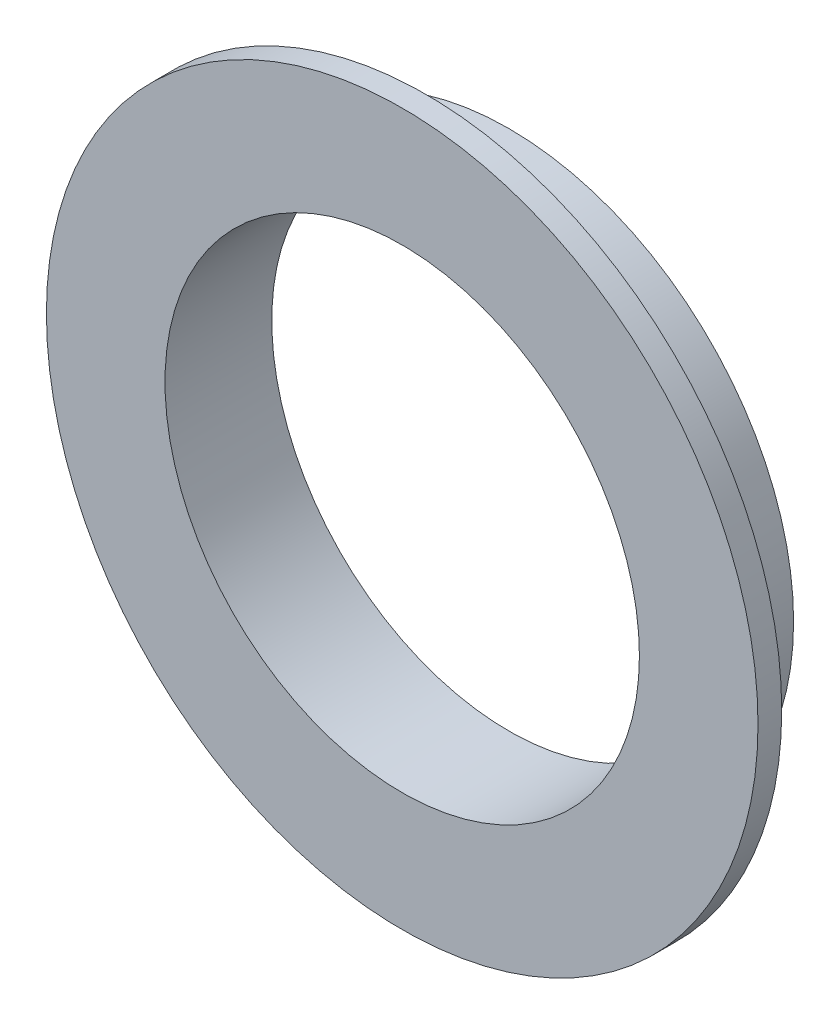
ISO-10303-21;
HEADER;
FILE_DESCRIPTION(('STEP AP214'),'2;1');
FILE_NAME('part.step','',(''),(''),'','','');
FILE_SCHEMA(('AUTOMOTIVE_DESIGN { 1 0 10303 214 1 1 1 1 }'));
ENDSEC;
DATA;
#1=APPLICATION_CONTEXT('core data for automotive mechanical design processes');
#2=APPLICATION_PROTOCOL_DEFINITION('international standard','automotive_design',2000,#1);
#3=PRODUCT_CONTEXT('',#1,'mechanical');
#4=PRODUCT('Part','Part','',(#3));
#5=PRODUCT_RELATED_PRODUCT_CATEGORY('part','',(#4));
#6=PRODUCT_DEFINITION_FORMATION('','',#4);
#7=PRODUCT_DEFINITION_CONTEXT('part definition',#1,'design');
#8=PRODUCT_DEFINITION('design','',#6,#7);
#9=PRODUCT_DEFINITION_SHAPE('','',#8);
#10=(LENGTH_UNIT() NAMED_UNIT(*) SI_UNIT(.MILLI.,.METRE.));
#11=(NAMED_UNIT(*) PLANE_ANGLE_UNIT() SI_UNIT($,.RADIAN.));
#12=(NAMED_UNIT(*) SI_UNIT($,.STERADIAN.) SOLID_ANGLE_UNIT());
#13=UNCERTAINTY_MEASURE_WITH_UNIT(LENGTH_MEASURE(1.E-05),#10,'distance_accuracy_value','');
#14=(GEOMETRIC_REPRESENTATION_CONTEXT(3) GLOBAL_UNCERTAINTY_ASSIGNED_CONTEXT((#13)) GLOBAL_UNIT_ASSIGNED_CONTEXT((#10,
#11,#12)) REPRESENTATION_CONTEXT('',''));
#15=CARTESIAN_POINT('',(0.,0.,0.));
#16=DIRECTION('',(0.,0.,1.));
#17=DIRECTION('',(1.,0.,0.));
#18=AXIS2_PLACEMENT_3D('',#15,#16,#17);
#19=CARTESIAN_POINT('',(0.,0.,4.52264516129032));
#20=DIRECTION('',(0.,0.,-1.));
#21=DIRECTION('',(-1.,0.,0.));
#22=AXIS2_PLACEMENT_3D('',#19,#20,#21);
#23=CYLINDRICAL_SURFACE('',#22,12.156);
#24=CARTESIAN_POINT('',(0.,0.,-0.0358548387096772));
#25=DIRECTION('',(0.,0.,1.));
#26=DIRECTION('',(1.,0.,0.));
#27=AXIS2_PLACEMENT_3D('',#24,#25,#26);
#28=CIRCLE('',#27,12.156);
#29=CARTESIAN_POINT('',(12.156,0.,-0.0358548387096772));
#30=VERTEX_POINT('',#29);
#31=EDGE_CURVE('E45',#30,#30,#28,.T.);
#32=ORIENTED_EDGE('',*,*,#31,.T.);
#33=EDGE_LOOP('',(#32));
#34=FACE_BOUND('',#33,.T.);
#35=CARTESIAN_POINT('',(0.,0.,3.50964516129032));
#36=DIRECTION('',(0.,0.,1.));
#37=DIRECTION('',(1.,0.,0.));
#38=AXIS2_PLACEMENT_3D('',#35,#36,#37);
#39=CIRCLE('',#38,12.156);
#40=CARTESIAN_POINT('',(12.156,0.,3.50964516129032));
#41=VERTEX_POINT('',#40);
#42=EDGE_CURVE('E10',#41,#41,#39,.T.);
#43=ORIENTED_EDGE('',*,*,#42,.F.);
#44=EDGE_LOOP('',(#43));
#45=FACE_BOUND('',#44,.T.);
#46=ADVANCED_FACE('F39',(#34,#45),#23,.T.);
#47=CARTESIAN_POINT('',(0.,0.,4.52264516129032));
#48=DIRECTION('',(0.,0.,1.));
#49=DIRECTION('',(1.,0.,0.));
#50=AXIS2_PLACEMENT_3D('',#47,#48,#49);
#51=PLANE('',#50);
#52=CARTESIAN_POINT('',(0.,0.,4.52264516129032));
#53=DIRECTION('',(0.,0.,1.));
#54=DIRECTION('',(1.,0.,0.));
#55=AXIS2_PLACEMENT_3D('',#52,#53,#54);
#56=CIRCLE('',#55,15.195);
#57=CARTESIAN_POINT('',(15.195,0.,4.52264516129032));
#58=VERTEX_POINT('',#57);
#59=EDGE_CURVE('E59',#58,#58,#56,.T.);
#60=ORIENTED_EDGE('',*,*,#59,.T.);
#61=EDGE_LOOP('',(#60));
#62=FACE_BOUND('',#61,.T.);
#63=CARTESIAN_POINT('',(0.,0.,4.52264516129032));
#64=DIRECTION('',(0.,0.,1.));
#65=DIRECTION('',(1.,0.,0.));
#66=AXIS2_PLACEMENT_3D('',#63,#64,#65);
#67=CIRCLE('',#66,10.13);
#68=CARTESIAN_POINT('',(10.13,0.,4.52264516129032));
#69=VERTEX_POINT('',#68);
#70=EDGE_CURVE('E49',#69,#69,#67,.T.);
#71=ORIENTED_EDGE('',*,*,#70,.F.);
#72=EDGE_LOOP('',(#71));
#73=FACE_BOUND('',#72,.T.);
#74=ADVANCED_FACE('F77',(#62,#73),#51,.T.);
#75=CARTESIAN_POINT('',(0.,0.,-0.0358548387096772));
#76=DIRECTION('',(0.,0.,1.));
#77=DIRECTION('',(1.,0.,0.));
#78=AXIS2_PLACEMENT_3D('',#75,#76,#77);
#79=PLANE('',#78);
#80=ORIENTED_EDGE('',*,*,#31,.F.);
#81=EDGE_LOOP('',(#80));
#82=FACE_BOUND('',#81,.T.);
#83=CARTESIAN_POINT('',(0.,0.,-0.0358548387096772));
#84=DIRECTION('',(0.,0.,1.));
#85=DIRECTION('',(1.,0.,0.));
#86=AXIS2_PLACEMENT_3D('',#83,#84,#85);
#87=CIRCLE('',#86,10.13);
#88=CARTESIAN_POINT('',(10.13,0.,-0.0358548387096772));
#89=VERTEX_POINT('',#88);
#90=EDGE_CURVE('E53',#89,#89,#87,.T.);
#91=ORIENTED_EDGE('',*,*,#90,.T.);
#92=EDGE_LOOP('',(#91));
#93=FACE_BOUND('',#92,.T.);
#94=ADVANCED_FACE('F81',(#82,#93),#79,.F.);
#95=CARTESIAN_POINT('',(0.,0.,4.52264516129032));
#96=DIRECTION('',(0.,0.,-1.));
#97=DIRECTION('',(-1.,0.,0.));
#98=AXIS2_PLACEMENT_3D('',#95,#96,#97);
#99=CYLINDRICAL_SURFACE('',#98,10.13);
#100=ORIENTED_EDGE('',*,*,#70,.T.);
#101=EDGE_LOOP('',(#100));
#102=FACE_BOUND('',#101,.T.);
#103=ORIENTED_EDGE('',*,*,#90,.F.);
#104=EDGE_LOOP('',(#103));
#105=FACE_BOUND('',#104,.T.);
#106=ADVANCED_FACE('F74',(#102,#105),#99,.F.);
#107=CARTESIAN_POINT('',(0.,0.,3.50964516129032));
#108=DIRECTION('',(0.,0.,1.));
#109=DIRECTION('',(1.,0.,0.));
#110=AXIS2_PLACEMENT_3D('',#107,#108,#109);
#111=CYLINDRICAL_SURFACE('',#110,15.195);
#112=CARTESIAN_POINT('',(0.,0.,3.50964516129032));
#113=DIRECTION('',(0.,0.,1.));
#114=DIRECTION('',(1.,0.,0.));
#115=AXIS2_PLACEMENT_3D('',#112,#113,#114);
#116=CIRCLE('',#115,15.195);
#117=CARTESIAN_POINT('',(15.195,0.,3.50964516129032));
#118=VERTEX_POINT('',#117);
#119=EDGE_CURVE('E57',#118,#118,#116,.T.);
#120=ORIENTED_EDGE('',*,*,#119,.T.);
#121=EDGE_LOOP('',(#120));
#122=FACE_BOUND('',#121,.T.);
#123=ORIENTED_EDGE('',*,*,#59,.F.);
#124=EDGE_LOOP('',(#123));
#125=FACE_BOUND('',#124,.T.);
#126=ADVANCED_FACE('F65',(#122,#125),#111,.T.);
#127=CARTESIAN_POINT('',(0.,0.,3.50964516129032));
#128=DIRECTION('',(0.,0.,1.));
#129=DIRECTION('',(1.,0.,0.));
#130=AXIS2_PLACEMENT_3D('',#127,#128,#129);
#131=PLANE('',#130);
#132=ORIENTED_EDGE('',*,*,#42,.T.);
#133=EDGE_LOOP('',(#132));
#134=FACE_BOUND('',#133,.T.);
#135=ORIENTED_EDGE('',*,*,#119,.F.);
#136=EDGE_LOOP('',(#135));
#137=FACE_BOUND('',#136,.T.);
#138=ADVANCED_FACE('F68',(#134,#137),#131,.F.);
#139=CLOSED_SHELL('',(#46,#74,#94,#106,#126,#138));
#140=MANIFOLD_SOLID_BREP('B2',#139);
#141=ADVANCED_BREP_SHAPE_REPRESENTATION('',(#18,#140),#14);
#142=SHAPE_DEFINITION_REPRESENTATION(#9,#141);
ENDSEC;
END-ISO-10303-21;
